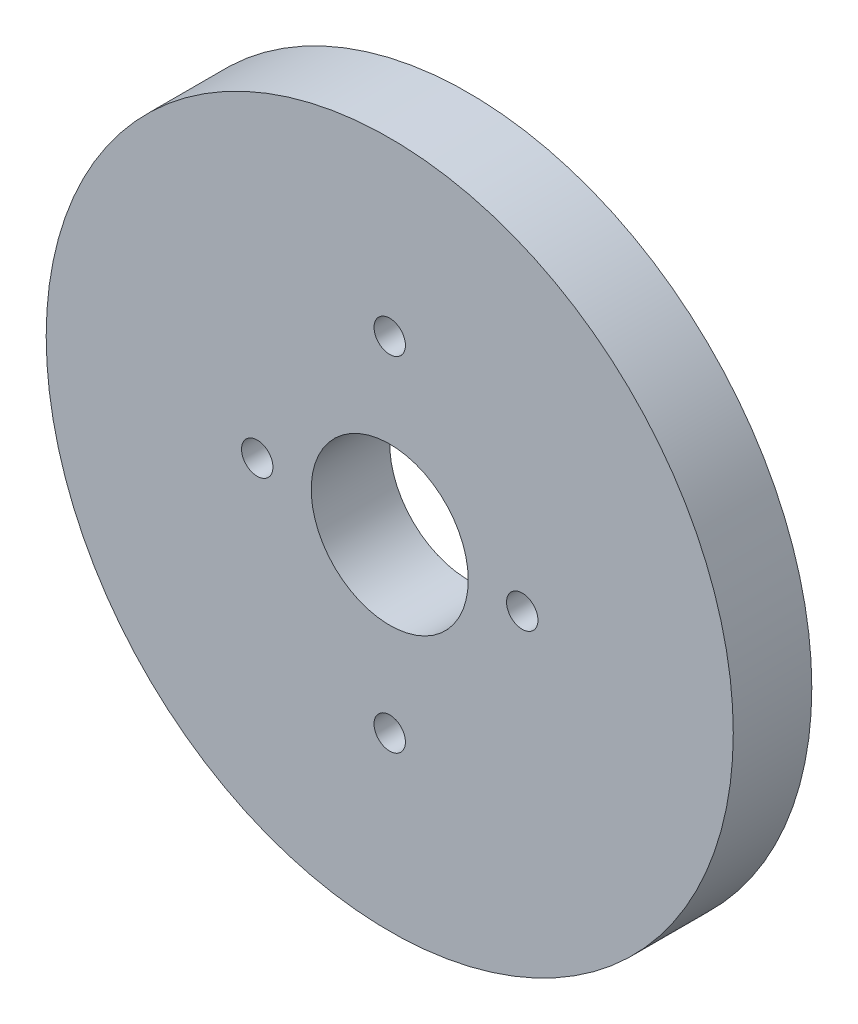
ISO-10303-21;
HEADER;
FILE_DESCRIPTION(('STEP AP214'),'2;1');
FILE_NAME('part.step','',(''),(''),'','','');
FILE_SCHEMA(('AUTOMOTIVE_DESIGN { 1 0 10303 214 1 1 1 1 }'));
ENDSEC;
DATA;
#1=APPLICATION_CONTEXT('core data for automotive mechanical design processes');
#2=APPLICATION_PROTOCOL_DEFINITION('international standard','automotive_design',2000,#1);
#3=PRODUCT_CONTEXT('',#1,'mechanical');
#4=PRODUCT('Part','Part','',(#3));
#5=PRODUCT_RELATED_PRODUCT_CATEGORY('part','',(#4));
#6=PRODUCT_DEFINITION_FORMATION('','',#4);
#7=PRODUCT_DEFINITION_CONTEXT('part definition',#1,'design');
#8=PRODUCT_DEFINITION('design','',#6,#7);
#9=PRODUCT_DEFINITION_SHAPE('','',#8);
#10=(LENGTH_UNIT() NAMED_UNIT(*) SI_UNIT(.MILLI.,.METRE.));
#11=(NAMED_UNIT(*) PLANE_ANGLE_UNIT() SI_UNIT($,.RADIAN.));
#12=(NAMED_UNIT(*) SI_UNIT($,.STERADIAN.) SOLID_ANGLE_UNIT());
#13=UNCERTAINTY_MEASURE_WITH_UNIT(LENGTH_MEASURE(1.E-05),#10,'distance_accuracy_value','');
#14=(GEOMETRIC_REPRESENTATION_CONTEXT(3) GLOBAL_UNCERTAINTY_ASSIGNED_CONTEXT((#13)) GLOBAL_UNIT_ASSIGNED_CONTEXT((#10,
#11,#12)) REPRESENTATION_CONTEXT('',''));
#15=CARTESIAN_POINT('',(0.,0.,0.));
#16=DIRECTION('',(0.,0.,1.));
#17=DIRECTION('',(1.,0.,0.));
#18=AXIS2_PLACEMENT_3D('',#15,#16,#17);
#19=CARTESIAN_POINT('',(0.,0.,4.));
#20=DIRECTION('',(0.,0.,1.));
#21=DIRECTION('',(1.,0.,0.));
#22=AXIS2_PLACEMENT_3D('',#19,#20,#21);
#23=PLANE('',#22);
#24=CARTESIAN_POINT('',(0.,-8.75,4.));
#25=DIRECTION('',(0.,0.,1.));
#26=DIRECTION('',(-1.,0.,0.));
#27=AXIS2_PLACEMENT_3D('',#24,#25,#26);
#28=CIRCLE('',#27,0.8);
#29=CARTESIAN_POINT('',(-0.8,-8.75,4.));
#30=VERTEX_POINT('',#29);
#31=EDGE_CURVE('E64',#30,#30,#28,.T.);
#32=ORIENTED_EDGE('',*,*,#31,.F.);
#33=EDGE_LOOP('',(#32));
#34=FACE_BOUND('',#33,.T.);
#35=CARTESIAN_POINT('',(6.75,0.,4.));
#36=DIRECTION('',(0.,0.,1.));
#37=DIRECTION('',(1.,0.,0.));
#38=AXIS2_PLACEMENT_3D('',#35,#36,#37);
#39=CIRCLE('',#38,0.8);
#40=CARTESIAN_POINT('',(7.55,0.,4.));
#41=VERTEX_POINT('',#40);
#42=EDGE_CURVE('E52',#41,#41,#39,.T.);
#43=ORIENTED_EDGE('',*,*,#42,.F.);
#44=EDGE_LOOP('',(#43));
#45=FACE_BOUND('',#44,.T.);
#46=CARTESIAN_POINT('',(0.,0.,4.));
#47=DIRECTION('',(0.,0.,1.));
#48=DIRECTION('',(1.,0.,0.));
#49=AXIS2_PLACEMENT_3D('',#46,#47,#48);
#50=CIRCLE('',#49,17.5);
#51=CARTESIAN_POINT('',(17.5,0.,4.));
#52=VERTEX_POINT('',#51);
#53=EDGE_CURVE('E10',#52,#52,#50,.T.);
#54=ORIENTED_EDGE('',*,*,#53,.T.);
#55=EDGE_LOOP('',(#54));
#56=FACE_BOUND('',#55,.T.);
#57=CARTESIAN_POINT('',(0.,0.,4.));
#58=DIRECTION('',(0.,0.,1.));
#59=DIRECTION('',(1.,0.,0.));
#60=AXIS2_PLACEMENT_3D('',#57,#58,#59);
#61=CIRCLE('',#60,4.);
#62=CARTESIAN_POINT('',(4.,0.,4.));
#63=VERTEX_POINT('',#62);
#64=EDGE_CURVE('E47',#63,#63,#61,.T.);
#65=ORIENTED_EDGE('',*,*,#64,.F.);
#66=EDGE_LOOP('',(#65));
#67=FACE_BOUND('',#66,.T.);
#68=CARTESIAN_POINT('',(0.,8.75,4.));
#69=DIRECTION('',(0.,0.,1.));
#70=DIRECTION('',(1.,0.,0.));
#71=AXIS2_PLACEMENT_3D('',#68,#69,#70);
#72=CIRCLE('',#71,0.8);
#73=CARTESIAN_POINT('',(0.8,8.75,4.));
#74=VERTEX_POINT('',#73);
#75=EDGE_CURVE('E58',#74,#74,#72,.T.);
#76=ORIENTED_EDGE('',*,*,#75,.F.);
#77=EDGE_LOOP('',(#76));
#78=FACE_BOUND('',#77,.T.);
#79=CARTESIAN_POINT('',(-6.75,0.,4.));
#80=DIRECTION('',(0.,0.,1.));
#81=DIRECTION('',(-1.,0.,0.));
#82=AXIS2_PLACEMENT_3D('',#79,#80,#81);
#83=CIRCLE('',#82,0.8);
#84=CARTESIAN_POINT('',(-7.55,0.,4.));
#85=VERTEX_POINT('',#84);
#86=EDGE_CURVE('E70',#85,#85,#83,.T.);
#87=ORIENTED_EDGE('',*,*,#86,.F.);
#88=EDGE_LOOP('',(#87));
#89=FACE_BOUND('',#88,.T.);
#90=ADVANCED_FACE('F36',(#34,#45,#56,#67,#78,#89),#23,.T.);
#91=CARTESIAN_POINT('',(0.,0.,0.));
#92=DIRECTION('',(0.,0.,1.));
#93=DIRECTION('',(1.,0.,0.));
#94=AXIS2_PLACEMENT_3D('',#91,#92,#93);
#95=PLANE('',#94);
#96=CARTESIAN_POINT('',(0.,-8.75,0.));
#97=DIRECTION('',(0.,0.,1.));
#98=DIRECTION('',(-1.,0.,0.));
#99=AXIS2_PLACEMENT_3D('',#96,#97,#98);
#100=CIRCLE('',#99,0.8);
#101=CARTESIAN_POINT('',(-0.8,-8.75,0.));
#102=VERTEX_POINT('',#101);
#103=EDGE_CURVE('E67',#102,#102,#100,.T.);
#104=ORIENTED_EDGE('',*,*,#103,.T.);
#105=EDGE_LOOP('',(#104));
#106=FACE_BOUND('',#105,.T.);
#107=CARTESIAN_POINT('',(6.75,0.,0.));
#108=DIRECTION('',(0.,0.,1.));
#109=DIRECTION('',(1.,0.,0.));
#110=AXIS2_PLACEMENT_3D('',#107,#108,#109);
#111=CIRCLE('',#110,0.8);
#112=CARTESIAN_POINT('',(7.55,0.,0.));
#113=VERTEX_POINT('',#112);
#114=EDGE_CURVE('E55',#113,#113,#111,.T.);
#115=ORIENTED_EDGE('',*,*,#114,.T.);
#116=EDGE_LOOP('',(#115));
#117=FACE_BOUND('',#116,.T.);
#118=CARTESIAN_POINT('',(0.,0.,0.));
#119=DIRECTION('',(0.,0.,1.));
#120=DIRECTION('',(1.,0.,0.));
#121=AXIS2_PLACEMENT_3D('',#118,#119,#120);
#122=CIRCLE('',#121,17.5);
#123=CARTESIAN_POINT('',(17.5,0.,0.));
#124=VERTEX_POINT('',#123);
#125=EDGE_CURVE('E40',#124,#124,#122,.T.);
#126=ORIENTED_EDGE('',*,*,#125,.F.);
#127=EDGE_LOOP('',(#126));
#128=FACE_BOUND('',#127,.T.);
#129=CARTESIAN_POINT('',(0.,0.,0.));
#130=DIRECTION('',(0.,0.,1.));
#131=DIRECTION('',(1.,0.,0.));
#132=AXIS2_PLACEMENT_3D('',#129,#130,#131);
#133=CIRCLE('',#132,4.);
#134=CARTESIAN_POINT('',(4.,0.,0.));
#135=VERTEX_POINT('',#134);
#136=EDGE_CURVE('E49',#135,#135,#133,.T.);
#137=ORIENTED_EDGE('',*,*,#136,.T.);
#138=EDGE_LOOP('',(#137));
#139=FACE_BOUND('',#138,.T.);
#140=CARTESIAN_POINT('',(0.,8.75,0.));
#141=DIRECTION('',(0.,0.,1.));
#142=DIRECTION('',(1.,0.,0.));
#143=AXIS2_PLACEMENT_3D('',#140,#141,#142);
#144=CIRCLE('',#143,0.8);
#145=CARTESIAN_POINT('',(0.8,8.75,0.));
#146=VERTEX_POINT('',#145);
#147=EDGE_CURVE('E61',#146,#146,#144,.T.);
#148=ORIENTED_EDGE('',*,*,#147,.T.);
#149=EDGE_LOOP('',(#148));
#150=FACE_BOUND('',#149,.T.);
#151=CARTESIAN_POINT('',(-6.75,0.,0.));
#152=DIRECTION('',(0.,0.,1.));
#153=DIRECTION('',(-1.,0.,0.));
#154=AXIS2_PLACEMENT_3D('',#151,#152,#153);
#155=CIRCLE('',#154,0.8);
#156=CARTESIAN_POINT('',(-7.55,0.,0.));
#157=VERTEX_POINT('',#156);
#158=EDGE_CURVE('E73',#157,#157,#155,.T.);
#159=ORIENTED_EDGE('',*,*,#158,.T.);
#160=EDGE_LOOP('',(#159));
#161=FACE_BOUND('',#160,.T.);
#162=ADVANCED_FACE('F83',(#106,#117,#128,#139,#150,#161),#95,.F.);
#163=CARTESIAN_POINT('',(0.,0.,4.));
#164=DIRECTION('',(0.,0.,-1.));
#165=DIRECTION('',(-1.,0.,0.));
#166=AXIS2_PLACEMENT_3D('',#163,#164,#165);
#167=CYLINDRICAL_SURFACE('',#166,17.5);
#168=ORIENTED_EDGE('',*,*,#53,.F.);
#169=EDGE_LOOP('',(#168));
#170=FACE_BOUND('',#169,.T.);
#171=ORIENTED_EDGE('',*,*,#125,.T.);
#172=EDGE_LOOP('',(#171));
#173=FACE_BOUND('',#172,.T.);
#174=ADVANCED_FACE('F38',(#170,#173),#167,.T.);
#175=CARTESIAN_POINT('',(0.,0.,4.));
#176=DIRECTION('',(0.,0.,-1.));
#177=DIRECTION('',(-1.,0.,0.));
#178=AXIS2_PLACEMENT_3D('',#175,#176,#177);
#179=CYLINDRICAL_SURFACE('',#178,4.);
#180=ORIENTED_EDGE('',*,*,#64,.T.);
#181=EDGE_LOOP('',(#180));
#182=FACE_BOUND('',#181,.T.);
#183=ORIENTED_EDGE('',*,*,#136,.F.);
#184=EDGE_LOOP('',(#183));
#185=FACE_BOUND('',#184,.T.);
#186=ADVANCED_FACE('F93',(#182,#185),#179,.F.);
#187=CARTESIAN_POINT('',(6.75,0.,4.));
#188=DIRECTION('',(0.,0.,-1.));
#189=DIRECTION('',(-1.,0.,0.));
#190=AXIS2_PLACEMENT_3D('',#187,#188,#189);
#191=CYLINDRICAL_SURFACE('',#190,0.8);
#192=ORIENTED_EDGE('',*,*,#42,.T.);
#193=EDGE_LOOP('',(#192));
#194=FACE_BOUND('',#193,.T.);
#195=ORIENTED_EDGE('',*,*,#114,.F.);
#196=EDGE_LOOP('',(#195));
#197=FACE_BOUND('',#196,.T.);
#198=ADVANCED_FACE('F96',(#194,#197),#191,.F.);
#199=CARTESIAN_POINT('',(0.,8.75,4.));
#200=DIRECTION('',(0.,0.,-1.));
#201=DIRECTION('',(-1.,0.,0.));
#202=AXIS2_PLACEMENT_3D('',#199,#200,#201);
#203=CYLINDRICAL_SURFACE('',#202,0.8);
#204=ORIENTED_EDGE('',*,*,#75,.T.);
#205=EDGE_LOOP('',(#204));
#206=FACE_BOUND('',#205,.T.);
#207=ORIENTED_EDGE('',*,*,#147,.F.);
#208=EDGE_LOOP('',(#207));
#209=FACE_BOUND('',#208,.T.);
#210=ADVANCED_FACE('F100',(#206,#209),#203,.F.);
#211=CARTESIAN_POINT('',(0.,-8.75,4.));
#212=DIRECTION('',(0.,0.,-1.));
#213=DIRECTION('',(-1.,0.,0.));
#214=AXIS2_PLACEMENT_3D('',#211,#212,#213);
#215=CYLINDRICAL_SURFACE('',#214,0.8);
#216=ORIENTED_EDGE('',*,*,#31,.T.);
#217=EDGE_LOOP('',(#216));
#218=FACE_BOUND('',#217,.T.);
#219=ORIENTED_EDGE('',*,*,#103,.F.);
#220=EDGE_LOOP('',(#219));
#221=FACE_BOUND('',#220,.T.);
#222=ADVANCED_FACE('F104',(#218,#221),#215,.F.);
#223=CARTESIAN_POINT('',(-6.75,0.,4.));
#224=DIRECTION('',(0.,0.,-1.));
#225=DIRECTION('',(-1.,0.,0.));
#226=AXIS2_PLACEMENT_3D('',#223,#224,#225);
#227=CYLINDRICAL_SURFACE('',#226,0.8);
#228=ORIENTED_EDGE('',*,*,#86,.T.);
#229=EDGE_LOOP('',(#228));
#230=FACE_BOUND('',#229,.T.);
#231=ORIENTED_EDGE('',*,*,#158,.F.);
#232=EDGE_LOOP('',(#231));
#233=FACE_BOUND('',#232,.T.);
#234=ADVANCED_FACE('F79',(#230,#233),#227,.F.);
#235=CLOSED_SHELL('',(#90,#162,#174,#186,#198,#210,#222,#234));
#236=MANIFOLD_SOLID_BREP('B2',#235);
#237=ADVANCED_BREP_SHAPE_REPRESENTATION('',(#18,#236),#14);
#238=SHAPE_DEFINITION_REPRESENTATION(#9,#237);
ENDSEC;
END-ISO-10303-21;
